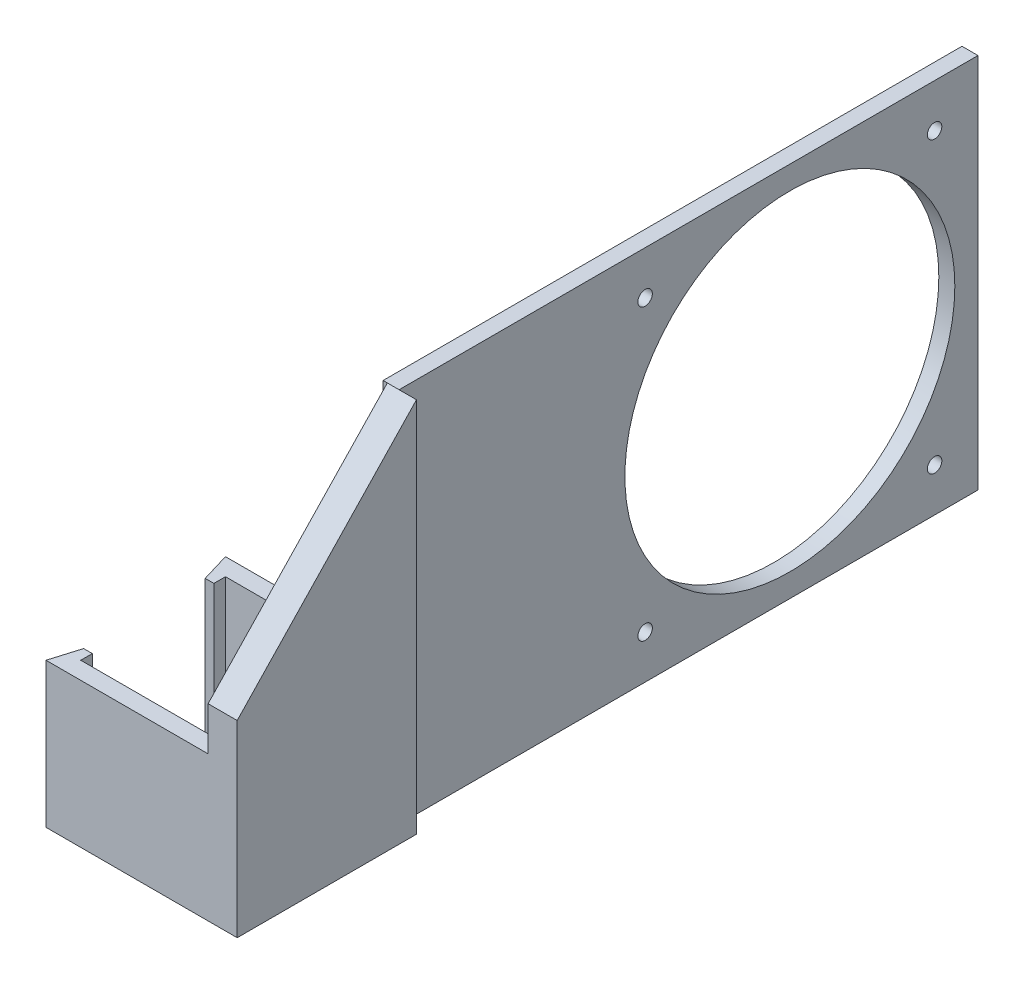
ISO-10303-21;
HEADER;
FILE_DESCRIPTION(('STEP AP214'),'2;1');
FILE_NAME('part.step','',(''),(''),'','','');
FILE_SCHEMA(('AUTOMOTIVE_DESIGN { 1 0 10303 214 1 1 1 1 }'));
ENDSEC;
DATA;
#1=APPLICATION_CONTEXT('core data for automotive mechanical design processes');
#2=APPLICATION_PROTOCOL_DEFINITION('international standard','automotive_design',2000,#1);
#3=PRODUCT_CONTEXT('',#1,'mechanical');
#4=PRODUCT('Part','Part','',(#3));
#5=PRODUCT_RELATED_PRODUCT_CATEGORY('part','',(#4));
#6=PRODUCT_DEFINITION_FORMATION('','',#4);
#7=PRODUCT_DEFINITION_CONTEXT('part definition',#1,'design');
#8=PRODUCT_DEFINITION('design','',#6,#7);
#9=PRODUCT_DEFINITION_SHAPE('','',#8);
#10=(LENGTH_UNIT() NAMED_UNIT(*) SI_UNIT(.MILLI.,.METRE.));
#11=(NAMED_UNIT(*) PLANE_ANGLE_UNIT() SI_UNIT($,.RADIAN.));
#12=(NAMED_UNIT(*) SI_UNIT($,.STERADIAN.) SOLID_ANGLE_UNIT());
#13=UNCERTAINTY_MEASURE_WITH_UNIT(LENGTH_MEASURE(1.E-05),#10,'distance_accuracy_value','');
#14=(GEOMETRIC_REPRESENTATION_CONTEXT(3) GLOBAL_UNCERTAINTY_ASSIGNED_CONTEXT((#13)) GLOBAL_UNIT_ASSIGNED_CONTEXT((#10,
#11,#12)) REPRESENTATION_CONTEXT('',''));
#15=CARTESIAN_POINT('',(0.,0.,0.));
#16=DIRECTION('',(0.,0.,1.));
#17=DIRECTION('',(1.,0.,0.));
#18=AXIS2_PLACEMENT_3D('',#15,#16,#17);
#19=CARTESIAN_POINT('',(0.,25.,0.));
#20=DIRECTION('',(0.,1.,0.));
#21=DIRECTION('',(0.,0.,1.));
#22=AXIS2_PLACEMENT_3D('',#19,#20,#21);
#23=PLANE('',#22);
#24=DIRECTION('',(1.,0.,0.));
#25=VECTOR('',#24,1.);
#26=CARTESIAN_POINT('',(-66.8257575757576,25.,-3.96973979401218));
#27=LINE('',#26,#25);
#28=CARTESIAN_POINT('',(-66.8257575757576,25.,-3.96973979401218));
#29=VERTEX_POINT('',#28);
#30=CARTESIAN_POINT('',(-38.8257575757576,25.,-3.96973979401218));
#31=VERTEX_POINT('',#30);
#32=EDGE_CURVE('E260',#29,#31,#27,.T.);
#33=ORIENTED_EDGE('',*,*,#32,.T.);
#34=DIRECTION('',(0.,0.,1.));
#35=VECTOR('',#34,1.);
#36=CARTESIAN_POINT('',(-38.8257575757576,25.,-34.9382664031757));
#37=LINE('',#36,#35);
#38=CARTESIAN_POINT('',(-38.8257575757576,25.,-6.96973979401218));
#39=VERTEX_POINT('',#38);
#40=EDGE_CURVE('E390',#39,#31,#37,.T.);
#41=ORIENTED_EDGE('',*,*,#40,.F.);
#42=DIRECTION('',(-1.,0.,0.));
#43=VECTOR('',#42,1.);
#44=CARTESIAN_POINT('',(-38.8257575757576,25.,-6.96973979401218));
#45=LINE('',#44,#43);
#46=CARTESIAN_POINT('',(-63.8257575757576,25.,-6.96973979401218));
#47=VERTEX_POINT('',#46);
#48=EDGE_CURVE('E253',#39,#47,#45,.T.);
#49=ORIENTED_EDGE('',*,*,#48,.T.);
#50=DIRECTION('',(0.,0.,-1.));
#51=VECTOR('',#50,1.);
#52=CARTESIAN_POINT('',(-63.8257575757576,25.,-6.96973979401218));
#53=LINE('',#52,#51);
#54=CARTESIAN_POINT('',(-63.8257575757576,25.,-8.96973979401218));
#55=VERTEX_POINT('',#54);
#56=EDGE_CURVE('E255',#47,#55,#53,.T.);
#57=ORIENTED_EDGE('',*,*,#56,.T.);
#58=DIRECTION('',(-1.,0.,0.));
#59=VECTOR('',#58,1.);
#60=CARTESIAN_POINT('',(-63.8257575757576,25.,-8.96973979401218));
#61=LINE('',#60,#59);
#62=CARTESIAN_POINT('',(-65.3257575757576,25.,-8.96973979401218));
#63=VERTEX_POINT('',#62);
#64=EDGE_CURVE('E257',#55,#63,#61,.T.);
#65=ORIENTED_EDGE('',*,*,#64,.T.);
#66=DIRECTION('',(-0.287347885566346,0.,0.957826285221151));
#67=VECTOR('',#66,1.);
#68=CARTESIAN_POINT('',(-66.8257575757576,25.,-3.96973979401218));
#69=LINE('',#68,#67);
#70=EDGE_CURVE('E227',#63,#29,#69,.T.);
#71=ORIENTED_EDGE('',*,*,#70,.T.);
#72=EDGE_LOOP('',(#33,#41,#49,#57,#65,#71));
#73=FACE_BOUND('',#72,.T.);
#74=ADVANCED_FACE('F37',(#73),#23,.T.);
#75=DIRECTION('',(1.,0.,0.));
#76=VECTOR('',#75,1.);
#77=CARTESIAN_POINT('',(-63.8257575757576,25.,-31.9697397940122));
#78=LINE('',#77,#76);
#79=CARTESIAN_POINT('',(-63.8257575757576,25.,-31.9697397940122));
#80=VERTEX_POINT('',#79);
#81=CARTESIAN_POINT('',(-38.8257575757576,25.,-31.9697397940122));
#82=VERTEX_POINT('',#81);
#83=EDGE_CURVE('E250',#80,#82,#78,.T.);
#84=ORIENTED_EDGE('',*,*,#83,.T.);
#85=CARTESIAN_POINT('',(-38.8257575757576,25.,-34.9382664031757));
#86=VERTEX_POINT('',#85);
#87=EDGE_CURVE('E367',#86,#82,#37,.T.);
#88=ORIENTED_EDGE('',*,*,#87,.F.);
#89=DIRECTION('',(1.,0.,0.));
#90=VECTOR('',#89,1.);
#91=CARTESIAN_POINT('',(0.,25.,-34.9382664031757));
#92=LINE('',#91,#90);
#93=CARTESIAN_POINT('',(-39.5643312219053,25.,-34.9382664031757));
#94=VERTEX_POINT('',#93);
#95=EDGE_CURVE('E429',#94,#86,#92,.T.);
#96=ORIENTED_EDGE('',*,*,#95,.F.);
#97=DIRECTION('',(0.,0.,-1.));
#98=VECTOR('',#97,1.);
#99=CARTESIAN_POINT('',(-39.5643312219053,25.,0.));
#100=LINE('',#99,#98);
#101=CARTESIAN_POINT('',(-39.5643312219053,25.,-44.9697397940123));
#102=VERTEX_POINT('',#101);
#103=EDGE_CURVE('E338',#94,#102,#100,.T.);
#104=ORIENTED_EDGE('',*,*,#103,.T.);
#105=DIRECTION('',(0.707106781186544,0.,-0.707106781186551));
#106=VECTOR('',#105,1.);
#107=CARTESIAN_POINT('',(-39.5643312219053,25.,-44.9697397940123));
#108=LINE('',#107,#106);
#109=CARTESIAN_POINT('',(-49.5643312219053,25.,-34.9697397940122));
#110=VERTEX_POINT('',#109);
#111=EDGE_CURVE('E46',#102,#110,#108,.F.);
#112=ORIENTED_EDGE('',*,*,#111,.T.);
#113=DIRECTION('',(-1.,0.,0.));
#114=VECTOR('',#113,1.);
#115=CARTESIAN_POINT('',(-36.5790075050805,25.,-34.9697397940122));
#116=LINE('',#115,#114);
#117=CARTESIAN_POINT('',(-66.8257575757576,25.,-34.9697397940122));
#118=VERTEX_POINT('',#117);
#119=EDGE_CURVE('E246',#110,#118,#116,.T.);
#120=ORIENTED_EDGE('',*,*,#119,.T.);
#121=DIRECTION('',(0.287347885566346,0.,0.957826285221151));
#122=VECTOR('',#121,1.);
#123=CARTESIAN_POINT('',(-66.8257575757576,25.,-34.9697397940122));
#124=LINE('',#123,#122);
#125=CARTESIAN_POINT('',(-65.3257575757576,25.,-29.9697397940122));
#126=VERTEX_POINT('',#125);
#127=EDGE_CURVE('E236',#118,#126,#124,.T.);
#128=ORIENTED_EDGE('',*,*,#127,.T.);
#129=DIRECTION('',(1.,0.,0.));
#130=VECTOR('',#129,1.);
#131=CARTESIAN_POINT('',(-66.8257575757576,25.,-29.9697397940122));
#132=LINE('',#131,#130);
#133=CARTESIAN_POINT('',(-63.8257575757576,25.,-29.9697397940122));
#134=VERTEX_POINT('',#133);
#135=EDGE_CURVE('E245',#126,#134,#132,.T.);
#136=ORIENTED_EDGE('',*,*,#135,.T.);
#137=DIRECTION('',(0.,0.,-1.));
#138=VECTOR('',#137,1.);
#139=CARTESIAN_POINT('',(-63.8257575757576,25.,-29.9697397940122));
#140=LINE('',#139,#138);
#141=EDGE_CURVE('E248',#134,#80,#140,.T.);
#142=ORIENTED_EDGE('',*,*,#141,.T.);
#143=EDGE_LOOP('',(#84,#88,#96,#104,#112,#120,#128,#136,#142));
#144=FACE_BOUND('',#143,.T.);
#145=ADVANCED_FACE('F355',(#144),#23,.T.);
#146=DIRECTION('',(0.,0.,1.));
#147=VECTOR('',#146,1.);
#148=CARTESIAN_POINT('',(-36.7989439252784,25.,0.));
#149=LINE('',#148,#147);
#150=CARTESIAN_POINT('',(-36.7989439252784,25.,-34.9697397940122));
#151=VERTEX_POINT('',#150);
#152=CARTESIAN_POINT('',(-36.7989439252784,25.,-34.9382664031757));
#153=VERTEX_POINT('',#152);
#154=EDGE_CURVE('E432',#151,#153,#149,.T.);
#155=ORIENTED_EDGE('',*,*,#154,.T.);
#156=DIRECTION('',(-1.,0.,0.));
#157=VECTOR('',#156,1.);
#158=CARTESIAN_POINT('',(-33.7989439252784,25.,-34.9382664031757));
#159=LINE('',#158,#157);
#160=CARTESIAN_POINT('',(-36.5643312219053,25.,-34.9382664031757));
#161=VERTEX_POINT('',#160);
#162=EDGE_CURVE('E392',#161,#153,#159,.T.);
#163=ORIENTED_EDGE('',*,*,#162,.F.);
#164=DIRECTION('',(-0.422618261740694,0.,-0.906307787036653));
#165=VECTOR('',#164,1.);
#166=CARTESIAN_POINT('',(-22.1234701022757,25.,-3.96973979401218));
#167=LINE('',#166,#165);
#168=CARTESIAN_POINT('',(-36.5790075050805,25.,-34.9697397940122));
#169=VERTEX_POINT('',#168);
#170=EDGE_CURVE('E263',#161,#169,#167,.T.);
#171=ORIENTED_EDGE('',*,*,#170,.T.);
#172=EDGE_CURVE('E242',#169,#151,#116,.T.);
#173=ORIENTED_EDGE('',*,*,#172,.T.);
#174=EDGE_LOOP('',(#155,#163,#171,#173));
#175=FACE_BOUND('',#174,.T.);
#176=ADVANCED_FACE('F474',(#175),#23,.T.);
#177=CARTESIAN_POINT('',(0.,0.,-34.9382664031757));
#178=DIRECTION('',(0.,0.,1.));
#179=DIRECTION('',(1.,0.,0.));
#180=AXIS2_PLACEMENT_3D('',#177,#178,#179);
#181=PLANE('',#180);
#182=ORIENTED_EDGE('',*,*,#95,.T.);
#183=DIRECTION('',(0.,-1.,0.));
#184=VECTOR('',#183,1.);
#185=CARTESIAN_POINT('',(-38.8257575757576,96.3738505099248,-34.9382664031757));
#186=LINE('',#185,#184);
#187=CARTESIAN_POINT('',(-38.8257575757576,65.,-34.9382664031757));
#188=VERTEX_POINT('',#187);
#189=EDGE_CURVE('E399',#188,#86,#186,.T.);
#190=ORIENTED_EDGE('',*,*,#189,.F.);
#191=DIRECTION('',(1.,0.,0.));
#192=VECTOR('',#191,1.);
#193=CARTESIAN_POINT('',(-36.7989439252784,65.,-34.9382664031757));
#194=LINE('',#193,#192);
#195=CARTESIAN_POINT('',(-39.5643312219053,65.,-34.9382664031757));
#196=VERTEX_POINT('',#195);
#197=EDGE_CURVE('E406',#196,#188,#194,.T.);
#198=ORIENTED_EDGE('',*,*,#197,.F.);
#199=DIRECTION('',(0.,1.,0.));
#200=VECTOR('',#199,1.);
#201=CARTESIAN_POINT('',(-39.5643312219053,0.,-34.9382664031757));
#202=LINE('',#201,#200);
#203=EDGE_CURVE('E416',#94,#196,#202,.T.);
#204=ORIENTED_EDGE('',*,*,#203,.F.);
#205=EDGE_LOOP('',(#182,#190,#198,#204));
#206=FACE_BOUND('',#205,.T.);
#207=ADVANCED_FACE('F491',(#206),#181,.T.);
#208=CARTESIAN_POINT('',(-36.5790075050805,25.,-34.9697397940122));
#209=DIRECTION('',(0.,0.,1.));
#210=DIRECTION('',(1.,0.,0.));
#211=AXIS2_PLACEMENT_3D('',#208,#209,#210);
#212=PLANE('',#211);
#213=DIRECTION('',(0.,-1.,0.));
#214=VECTOR('',#213,1.);
#215=CARTESIAN_POINT('',(-36.7989439252784,25.,-34.9697397940122));
#216=LINE('',#215,#214);
#217=CARTESIAN_POINT('',(-36.7989439252784,0.,-34.9697397940122));
#218=VERTEX_POINT('',#217);
#219=EDGE_CURVE('E435',#151,#218,#216,.T.);
#220=ORIENTED_EDGE('',*,*,#219,.F.);
#221=ORIENTED_EDGE('',*,*,#172,.F.);
#222=DIRECTION('',(0.,-1.,0.));
#223=VECTOR('',#222,1.);
#224=CARTESIAN_POINT('',(-36.5790075050805,25.,-34.9697397940122));
#225=LINE('',#224,#223);
#226=CARTESIAN_POINT('',(-36.5790075050805,0.,-34.9697397940122));
#227=VERTEX_POINT('',#226);
#228=EDGE_CURVE('E265',#169,#227,#225,.T.);
#229=ORIENTED_EDGE('',*,*,#228,.T.);
#230=DIRECTION('',(-1.,0.,0.));
#231=VECTOR('',#230,1.);
#232=CARTESIAN_POINT('',(-36.5790075050805,0.,-34.9697397940122));
#233=LINE('',#232,#231);
#234=EDGE_CURVE('E266',#227,#218,#233,.T.);
#235=ORIENTED_EDGE('',*,*,#234,.T.);
#236=EDGE_LOOP('',(#220,#221,#229,#235));
#237=FACE_BOUND('',#236,.T.);
#238=ADVANCED_FACE('F479',(#237),#212,.F.);
#239=ORIENTED_EDGE('',*,*,#119,.F.);
#240=DIRECTION('',(0.,-1.,0.));
#241=VECTOR('',#240,1.);
#242=CARTESIAN_POINT('',(-49.5643312219053,0.,-34.9697397940122));
#243=LINE('',#242,#241);
#244=CARTESIAN_POINT('',(-49.5643312219053,0.,-34.9697397940122));
#245=VERTEX_POINT('',#244);
#246=EDGE_CURVE('E59',#110,#245,#243,.T.);
#247=ORIENTED_EDGE('',*,*,#246,.T.);
#248=CARTESIAN_POINT('',(-66.8257575757576,0.,-34.9697397940122));
#249=VERTEX_POINT('',#248);
#250=EDGE_CURVE('E235',#245,#249,#233,.T.);
#251=ORIENTED_EDGE('',*,*,#250,.T.);
#252=DIRECTION('',(0.,-1.,0.));
#253=VECTOR('',#252,1.);
#254=CARTESIAN_POINT('',(-66.8257575757576,25.,-34.9697397940122));
#255=LINE('',#254,#253);
#256=EDGE_CURVE('E308',#118,#249,#255,.T.);
#257=ORIENTED_EDGE('',*,*,#256,.F.);
#258=EDGE_LOOP('',(#239,#247,#251,#257));
#259=FACE_BOUND('',#258,.T.);
#260=ADVANCED_FACE('F350',(#259),#212,.F.);
#261=CARTESIAN_POINT('',(-66.8257575757576,25.,-29.9697397940122));
#262=DIRECTION('',(0.,0.,-1.));
#263=DIRECTION('',(-1.,0.,0.));
#264=AXIS2_PLACEMENT_3D('',#261,#262,#263);
#265=PLANE('',#264);
#266=ORIENTED_EDGE('',*,*,#135,.F.);
#267=DIRECTION('',(0.,-1.,0.));
#268=VECTOR('',#267,1.);
#269=CARTESIAN_POINT('',(-65.3257575757576,25.,-29.9697397940122));
#270=LINE('',#269,#268);
#271=CARTESIAN_POINT('',(-65.3257575757576,0.,-29.9697397940122));
#272=VERTEX_POINT('',#271);
#273=EDGE_CURVE('E233',#126,#272,#270,.T.);
#274=ORIENTED_EDGE('',*,*,#273,.T.);
#275=DIRECTION('',(1.,0.,0.));
#276=VECTOR('',#275,1.);
#277=CARTESIAN_POINT('',(-66.8257575757576,0.,-29.9697397940122));
#278=LINE('',#277,#276);
#279=CARTESIAN_POINT('',(-63.8257575757576,0.,-29.9697397940122));
#280=VERTEX_POINT('',#279);
#281=EDGE_CURVE('E268',#272,#280,#278,.T.);
#282=ORIENTED_EDGE('',*,*,#281,.T.);
#283=DIRECTION('',(0.,-1.,0.));
#284=VECTOR('',#283,1.);
#285=CARTESIAN_POINT('',(-63.8257575757576,25.,-29.9697397940122));
#286=LINE('',#285,#284);
#287=EDGE_CURVE('E305',#134,#280,#286,.T.);
#288=ORIENTED_EDGE('',*,*,#287,.F.);
#289=EDGE_LOOP('',(#266,#274,#282,#288));
#290=FACE_BOUND('',#289,.T.);
#291=ADVANCED_FACE('F358',(#290),#265,.F.);
#292=CARTESIAN_POINT('',(-63.8257575757576,25.,-29.9697397940122));
#293=DIRECTION('',(-1.,0.,0.));
#294=DIRECTION('',(0.,0.,1.));
#295=AXIS2_PLACEMENT_3D('',#292,#293,#294);
#296=PLANE('',#295);
#297=DIRECTION('',(0.,0.,-1.));
#298=VECTOR('',#297,1.);
#299=CARTESIAN_POINT('',(-63.8257575757576,0.,-29.9697397940122));
#300=LINE('',#299,#298);
#301=CARTESIAN_POINT('',(-63.8257575757576,0.,-31.9697397940122));
#302=VERTEX_POINT('',#301);
#303=EDGE_CURVE('E270',#280,#302,#300,.T.);
#304=ORIENTED_EDGE('',*,*,#303,.T.);
#305=DIRECTION('',(0.,-1.,0.));
#306=VECTOR('',#305,1.);
#307=CARTESIAN_POINT('',(-63.8257575757576,25.,-31.9697397940122));
#308=LINE('',#307,#306);
#309=EDGE_CURVE('E302',#80,#302,#308,.T.);
#310=ORIENTED_EDGE('',*,*,#309,.F.);
#311=ORIENTED_EDGE('',*,*,#141,.F.);
#312=ORIENTED_EDGE('',*,*,#287,.T.);
#313=EDGE_LOOP('',(#304,#310,#311,#312));
#314=FACE_BOUND('',#313,.T.);
#315=ADVANCED_FACE('F363',(#314),#296,.F.);
#316=CARTESIAN_POINT('',(-63.8257575757576,25.,-31.9697397940122));
#317=DIRECTION('',(0.,0.,-1.));
#318=DIRECTION('',(-1.,0.,0.));
#319=AXIS2_PLACEMENT_3D('',#316,#317,#318);
#320=PLANE('',#319);
#321=DIRECTION('',(1.,0.,0.));
#322=VECTOR('',#321,1.);
#323=CARTESIAN_POINT('',(-63.8257575757576,0.,-31.9697397940122));
#324=LINE('',#323,#322);
#325=CARTESIAN_POINT('',(-38.8257575757576,0.,-31.9697397940122));
#326=VERTEX_POINT('',#325);
#327=EDGE_CURVE('E272',#302,#326,#324,.T.);
#328=ORIENTED_EDGE('',*,*,#327,.T.);
#329=DIRECTION('',(0.,-1.,0.));
#330=VECTOR('',#329,1.);
#331=CARTESIAN_POINT('',(-38.8257575757576,25.,-31.9697397940122));
#332=LINE('',#331,#330);
#333=EDGE_CURVE('E299',#82,#326,#332,.T.);
#334=ORIENTED_EDGE('',*,*,#333,.F.);
#335=ORIENTED_EDGE('',*,*,#83,.F.);
#336=ORIENTED_EDGE('',*,*,#309,.T.);
#337=EDGE_LOOP('',(#328,#334,#335,#336));
#338=FACE_BOUND('',#337,.T.);
#339=ADVANCED_FACE('F370',(#338),#320,.F.);
#340=CARTESIAN_POINT('',(-38.8257575757576,25.,-31.9697397940122));
#341=DIRECTION('',(1.,0.,0.));
#342=DIRECTION('',(0.,0.,-1.));
#343=AXIS2_PLACEMENT_3D('',#340,#341,#342);
#344=PLANE('',#343);
#345=DIRECTION('',(0.,-1.,0.));
#346=VECTOR('',#345,1.);
#347=CARTESIAN_POINT('',(-38.8257575757576,96.3738505099248,-3.96973979401218));
#348=LINE('',#347,#346);
#349=CARTESIAN_POINT('',(-38.8257575757576,32.5,-3.96973979401218));
#350=VERTEX_POINT('',#349);
#351=EDGE_CURVE('E394',#350,#31,#348,.T.);
#352=ORIENTED_EDGE('',*,*,#351,.F.);
#353=DIRECTION('',(0.,0.72395829288421,-0.689843743295669));
#354=VECTOR('',#353,1.);
#355=CARTESIAN_POINT('',(-38.8257575757576,42.5528396913205,-13.5488669779603));
#356=LINE('',#355,#354);
#357=EDGE_CURVE('E196',#350,#188,#356,.T.);
#358=ORIENTED_EDGE('',*,*,#357,.T.);
#359=ORIENTED_EDGE('',*,*,#189,.T.);
#360=ORIENTED_EDGE('',*,*,#87,.T.);
#361=ORIENTED_EDGE('',*,*,#333,.T.);
#362=DIRECTION('',(0.,0.,1.));
#363=VECTOR('',#362,1.);
#364=CARTESIAN_POINT('',(-38.8257575757576,0.,-31.9697397940122));
#365=LINE('',#364,#363);
#366=CARTESIAN_POINT('',(-38.8257575757576,0.,-6.96973979401218));
#367=VERTEX_POINT('',#366);
#368=EDGE_CURVE('E274',#326,#367,#365,.T.);
#369=ORIENTED_EDGE('',*,*,#368,.T.);
#370=DIRECTION('',(0.,-1.,0.));
#371=VECTOR('',#370,1.);
#372=CARTESIAN_POINT('',(-38.8257575757576,25.,-6.96973979401218));
#373=LINE('',#372,#371);
#374=EDGE_CURVE('E296',#39,#367,#373,.T.);
#375=ORIENTED_EDGE('',*,*,#374,.F.);
#376=ORIENTED_EDGE('',*,*,#40,.T.);
#377=EDGE_LOOP('',(#352,#358,#359,#360,#361,#369,#375,#376));
#378=FACE_BOUND('',#377,.T.);
#379=ADVANCED_FACE('F374',(#378),#344,.F.);
#380=CARTESIAN_POINT('',(-38.8257575757576,25.,-6.96973979401218));
#381=DIRECTION('',(0.,0.,1.));
#382=DIRECTION('',(1.,0.,0.));
#383=AXIS2_PLACEMENT_3D('',#380,#381,#382);
#384=PLANE('',#383);
#385=DIRECTION('',(-1.,0.,0.));
#386=VECTOR('',#385,1.);
#387=CARTESIAN_POINT('',(-38.8257575757576,0.,-6.96973979401218));
#388=LINE('',#387,#386);
#389=CARTESIAN_POINT('',(-63.8257575757576,0.,-6.96973979401218));
#390=VERTEX_POINT('',#389);
#391=EDGE_CURVE('E276',#367,#390,#388,.T.);
#392=ORIENTED_EDGE('',*,*,#391,.T.);
#393=DIRECTION('',(0.,-1.,0.));
#394=VECTOR('',#393,1.);
#395=CARTESIAN_POINT('',(-63.8257575757576,25.,-6.96973979401218));
#396=LINE('',#395,#394);
#397=EDGE_CURVE('E293',#47,#390,#396,.T.);
#398=ORIENTED_EDGE('',*,*,#397,.F.);
#399=ORIENTED_EDGE('',*,*,#48,.F.);
#400=ORIENTED_EDGE('',*,*,#374,.T.);
#401=EDGE_LOOP('',(#392,#398,#399,#400));
#402=FACE_BOUND('',#401,.T.);
#403=ADVANCED_FACE('F381',(#402),#384,.F.);
#404=CARTESIAN_POINT('',(-63.8257575757576,25.,-6.96973979401218));
#405=DIRECTION('',(-1.,0.,0.));
#406=DIRECTION('',(0.,0.,1.));
#407=AXIS2_PLACEMENT_3D('',#404,#405,#406);
#408=PLANE('',#407);
#409=DIRECTION('',(0.,0.,-1.));
#410=VECTOR('',#409,1.);
#411=CARTESIAN_POINT('',(-63.8257575757576,0.,-6.96973979401218));
#412=LINE('',#411,#410);
#413=CARTESIAN_POINT('',(-63.8257575757576,0.,-8.96973979401218));
#414=VERTEX_POINT('',#413);
#415=EDGE_CURVE('E278',#390,#414,#412,.T.);
#416=ORIENTED_EDGE('',*,*,#415,.T.);
#417=DIRECTION('',(0.,-1.,0.));
#418=VECTOR('',#417,1.);
#419=CARTESIAN_POINT('',(-63.8257575757576,25.,-8.96973979401218));
#420=LINE('',#419,#418);
#421=EDGE_CURVE('E290',#55,#414,#420,.T.);
#422=ORIENTED_EDGE('',*,*,#421,.F.);
#423=ORIENTED_EDGE('',*,*,#56,.F.);
#424=ORIENTED_EDGE('',*,*,#397,.T.);
#425=EDGE_LOOP('',(#416,#422,#423,#424));
#426=FACE_BOUND('',#425,.T.);
#427=ADVANCED_FACE('F385',(#426),#408,.F.);
#428=CARTESIAN_POINT('',(-63.8257575757576,25.,-8.96973979401218));
#429=DIRECTION('',(0.,0.,1.));
#430=DIRECTION('',(1.,0.,0.));
#431=AXIS2_PLACEMENT_3D('',#428,#429,#430);
#432=PLANE('',#431);
#433=DIRECTION('',(-1.,0.,0.));
#434=VECTOR('',#433,1.);
#435=CARTESIAN_POINT('',(-63.8257575757576,0.,-8.96973979401218));
#436=LINE('',#435,#434);
#437=CARTESIAN_POINT('',(-65.3257575757576,0.,-8.96973979401218));
#438=VERTEX_POINT('',#437);
#439=EDGE_CURVE('E280',#414,#438,#436,.T.);
#440=ORIENTED_EDGE('',*,*,#439,.T.);
#441=DIRECTION('',(0.,-1.,0.));
#442=VECTOR('',#441,1.);
#443=CARTESIAN_POINT('',(-65.3257575757576,25.,-8.96973979401218));
#444=LINE('',#443,#442);
#445=EDGE_CURVE('E230',#63,#438,#444,.T.);
#446=ORIENTED_EDGE('',*,*,#445,.F.);
#447=ORIENTED_EDGE('',*,*,#64,.F.);
#448=ORIENTED_EDGE('',*,*,#421,.T.);
#449=EDGE_LOOP('',(#440,#446,#447,#448));
#450=FACE_BOUND('',#449,.T.);
#451=ADVANCED_FACE('F516',(#450),#432,.F.);
#452=CARTESIAN_POINT('',(-66.8257575757576,25.,-3.96973979401218));
#453=DIRECTION('',(0.,0.,-1.));
#454=DIRECTION('',(-1.,0.,0.));
#455=AXIS2_PLACEMENT_3D('',#452,#453,#454);
#456=PLANE('',#455);
#457=DIRECTION('',(0.,-1.,0.));
#458=VECTOR('',#457,1.);
#459=CARTESIAN_POINT('',(-33.7989439252784,56.3695655108971,-3.96973979401218));
#460=LINE('',#459,#458);
#461=CARTESIAN_POINT('',(-33.7989439252784,32.5,-3.96973979401218));
#462=VERTEX_POINT('',#461);
#463=CARTESIAN_POINT('',(-33.7989439252784,0.,-3.96973979401218));
#464=VERTEX_POINT('',#463);
#465=EDGE_CURVE('E204',#462,#464,#460,.T.);
#466=ORIENTED_EDGE('',*,*,#465,.F.);
#467=DIRECTION('',(1.,0.,0.));
#468=VECTOR('',#467,1.);
#469=CARTESIAN_POINT('',(-133.798943925278,32.5,-3.96973979401218));
#470=LINE('',#469,#468);
#471=EDGE_CURVE('E190',#350,#462,#470,.T.);
#472=ORIENTED_EDGE('',*,*,#471,.F.);
#473=ORIENTED_EDGE('',*,*,#351,.T.);
#474=ORIENTED_EDGE('',*,*,#32,.F.);
#475=DIRECTION('',(0.,-1.,0.));
#476=VECTOR('',#475,1.);
#477=CARTESIAN_POINT('',(-66.8257575757576,25.,-3.96973979401218));
#478=LINE('',#477,#476);
#479=CARTESIAN_POINT('',(-66.8257575757576,0.,-3.96973979401218));
#480=VERTEX_POINT('',#479);
#481=EDGE_CURVE('E288',#29,#480,#478,.T.);
#482=ORIENTED_EDGE('',*,*,#481,.T.);
#483=DIRECTION('',(1.,0.,0.));
#484=VECTOR('',#483,1.);
#485=CARTESIAN_POINT('',(-66.8257575757576,0.,-3.96973979401218));
#486=LINE('',#485,#484);
#487=EDGE_CURVE('E214',#480,#464,#486,.T.);
#488=ORIENTED_EDGE('',*,*,#487,.T.);
#489=EDGE_LOOP('',(#466,#472,#473,#474,#482,#488));
#490=FACE_BOUND('',#489,.T.);
#491=ADVANCED_FACE('F211',(#490),#456,.F.);
#492=CARTESIAN_POINT('',(-22.1234701022757,25.,-3.96973979401218));
#493=DIRECTION('',(-0.906307787036653,0.,0.422618261740694));
#494=DIRECTION('',(0.422618261740694,0.,0.906307787036653));
#495=AXIS2_PLACEMENT_3D('',#492,#493,#494);
#496=PLANE('',#495);
#497=ORIENTED_EDGE('',*,*,#170,.F.);
#498=DIRECTION('',(0.,-1.,0.));
#499=VECTOR('',#498,1.);
#500=CARTESIAN_POINT('',(-36.5643312219053,25.,-34.9382664031757));
#501=LINE('',#500,#499);
#502=CARTESIAN_POINT('',(-36.5643312219053,0.,-34.9382664031757));
#503=VERTEX_POINT('',#502);
#504=EDGE_CURVE('E216',#161,#503,#501,.T.);
#505=ORIENTED_EDGE('',*,*,#504,.T.);
#506=DIRECTION('',(-0.422618261740694,0.,-0.906307787036653));
#507=VECTOR('',#506,1.);
#508=CARTESIAN_POINT('',(-22.1234701022757,0.,-3.96973979401218));
#509=LINE('',#508,#507);
#510=EDGE_CURVE('E284',#503,#227,#509,.T.);
#511=ORIENTED_EDGE('',*,*,#510,.T.);
#512=ORIENTED_EDGE('',*,*,#228,.F.);
#513=EDGE_LOOP('',(#497,#505,#511,#512));
#514=FACE_BOUND('',#513,.T.);
#515=ADVANCED_FACE('F510',(#514),#496,.F.);
#516=CARTESIAN_POINT('',(0.,0.,0.));
#517=DIRECTION('',(0.,1.,0.));
#518=DIRECTION('',(0.,0.,1.));
#519=AXIS2_PLACEMENT_3D('',#516,#517,#518);
#520=PLANE('',#519);
#521=ORIENTED_EDGE('',*,*,#250,.F.);
#522=DIRECTION('',(-0.707106781186544,0.,0.707106781186551));
#523=VECTOR('',#522,1.);
#524=CARTESIAN_POINT('',(-42.267035507959,0.,-42.2670355079585));
#525=LINE('',#524,#523);
#526=CARTESIAN_POINT('',(-39.5643312219053,0.,-44.9697397940123));
#527=VERTEX_POINT('',#526);
#528=EDGE_CURVE('E11',#245,#527,#525,.F.);
#529=ORIENTED_EDGE('',*,*,#528,.T.);
#530=DIRECTION('',(0.,0.,1.));
#531=VECTOR('',#530,1.);
#532=CARTESIAN_POINT('',(-39.5643312219053,0.,-134.938266403176));
#533=LINE('',#532,#531);
#534=CARTESIAN_POINT('',(-39.5643312219053,0.,-134.938266403176));
#535=VERTEX_POINT('',#534);
#536=EDGE_CURVE('E342',#535,#527,#533,.T.);
#537=ORIENTED_EDGE('',*,*,#536,.F.);
#538=DIRECTION('',(-1.,0.,0.));
#539=VECTOR('',#538,1.);
#540=CARTESIAN_POINT('',(-36.7989439252784,0.,-134.938266403176));
#541=LINE('',#540,#539);
#542=CARTESIAN_POINT('',(-36.7989439252784,0.,-134.938266403176));
#543=VERTEX_POINT('',#542);
#544=EDGE_CURVE('E405',#543,#535,#541,.T.);
#545=ORIENTED_EDGE('',*,*,#544,.F.);
#546=DIRECTION('',(0.,0.,1.));
#547=VECTOR('',#546,1.);
#548=CARTESIAN_POINT('',(-36.7989439252784,0.,-134.938266403176));
#549=LINE('',#548,#547);
#550=EDGE_CURVE('E426',#543,#218,#549,.T.);
#551=ORIENTED_EDGE('',*,*,#550,.T.);
#552=ORIENTED_EDGE('',*,*,#234,.F.);
#553=ORIENTED_EDGE('',*,*,#510,.F.);
#554=DIRECTION('',(1.,0.,0.));
#555=VECTOR('',#554,1.);
#556=CARTESIAN_POINT('',(-38.7989439252784,0.,-34.9382664031757));
#557=LINE('',#556,#555);
#558=CARTESIAN_POINT('',(-33.7989439252784,0.,-34.9382664031757));
#559=VERTEX_POINT('',#558);
#560=EDGE_CURVE('E224',#503,#559,#557,.T.);
#561=ORIENTED_EDGE('',*,*,#560,.T.);
#562=DIRECTION('',(0.,0.,1.));
#563=VECTOR('',#562,1.);
#564=CARTESIAN_POINT('',(-33.7989439252784,0.,-3.96973979401218));
#565=LINE('',#564,#563);
#566=EDGE_CURVE('E221',#559,#464,#565,.T.);
#567=ORIENTED_EDGE('',*,*,#566,.T.);
#568=ORIENTED_EDGE('',*,*,#487,.F.);
#569=DIRECTION('',(-0.287347885566346,0.,0.957826285221151));
#570=VECTOR('',#569,1.);
#571=CARTESIAN_POINT('',(-66.8257575757576,0.,-3.96973979401218));
#572=LINE('',#571,#570);
#573=EDGE_CURVE('E231',#438,#480,#572,.T.);
#574=ORIENTED_EDGE('',*,*,#573,.F.);
#575=ORIENTED_EDGE('',*,*,#439,.F.);
#576=ORIENTED_EDGE('',*,*,#415,.F.);
#577=ORIENTED_EDGE('',*,*,#391,.F.);
#578=ORIENTED_EDGE('',*,*,#368,.F.);
#579=ORIENTED_EDGE('',*,*,#327,.F.);
#580=ORIENTED_EDGE('',*,*,#303,.F.);
#581=ORIENTED_EDGE('',*,*,#281,.F.);
#582=DIRECTION('',(0.287347885566346,0.,0.957826285221151));
#583=VECTOR('',#582,1.);
#584=CARTESIAN_POINT('',(-66.8257575757576,0.,-34.9697397940122));
#585=LINE('',#584,#583);
#586=EDGE_CURVE('E219',#249,#272,#585,.T.);
#587=ORIENTED_EDGE('',*,*,#586,.F.);
#588=EDGE_LOOP('',(#521,#529,#537,#545,#551,#552,#553,#561,#567,#568,#574,#575,#576,#577,#578,
#579,#580,#581,#587));
#589=FACE_BOUND('',#588,.T.);
#590=ADVANCED_FACE('F346',(#589),#520,.F.);
#591=CARTESIAN_POINT('',(-66.8257575757576,25.,-34.9697397940122));
#592=DIRECTION('',(0.957826285221151,0.,-0.287347885566346));
#593=DIRECTION('',(-0.287347885566346,0.,-0.957826285221151));
#594=AXIS2_PLACEMENT_3D('',#591,#592,#593);
#595=PLANE('',#594);
#596=ORIENTED_EDGE('',*,*,#586,.T.);
#597=ORIENTED_EDGE('',*,*,#273,.F.);
#598=ORIENTED_EDGE('',*,*,#127,.F.);
#599=ORIENTED_EDGE('',*,*,#256,.T.);
#600=EDGE_LOOP('',(#596,#597,#598,#599));
#601=FACE_BOUND('',#600,.T.);
#602=ADVANCED_FACE('F353',(#601),#595,.F.);
#603=CARTESIAN_POINT('',(-66.8257575757576,25.,-3.96973979401218));
#604=DIRECTION('',(0.957826285221151,0.,0.287347885566346));
#605=DIRECTION('',(0.287347885566346,0.,-0.957826285221151));
#606=AXIS2_PLACEMENT_3D('',#603,#604,#605);
#607=PLANE('',#606);
#608=ORIENTED_EDGE('',*,*,#573,.T.);
#609=ORIENTED_EDGE('',*,*,#481,.F.);
#610=ORIENTED_EDGE('',*,*,#70,.F.);
#611=ORIENTED_EDGE('',*,*,#445,.T.);
#612=EDGE_LOOP('',(#608,#609,#610,#611));
#613=FACE_BOUND('',#612,.T.);
#614=ADVANCED_FACE('F549',(#613),#607,.F.);
#615=CARTESIAN_POINT('',(-38.7989439252784,56.3695655108971,-34.9382664031757));
#616=DIRECTION('',(0.,0.,-1.));
#617=DIRECTION('',(-1.,0.,0.));
#618=AXIS2_PLACEMENT_3D('',#615,#616,#617);
#619=PLANE('',#618);
#620=ORIENTED_EDGE('',*,*,#504,.F.);
#621=ORIENTED_EDGE('',*,*,#162,.T.);
#622=DIRECTION('',(0.,-1.,0.));
#623=VECTOR('',#622,1.);
#624=CARTESIAN_POINT('',(-36.7989439252784,0.,-34.9382664031757));
#625=LINE('',#624,#623);
#626=CARTESIAN_POINT('',(-36.7989439252784,65.,-34.9382664031757));
#627=VERTEX_POINT('',#626);
#628=EDGE_CURVE('E413',#627,#153,#625,.T.);
#629=ORIENTED_EDGE('',*,*,#628,.F.);
#630=DIRECTION('',(1.,0.,0.));
#631=VECTOR('',#630,1.);
#632=CARTESIAN_POINT('',(-33.7989439252784,65.,-34.9382664031757));
#633=LINE('',#632,#631);
#634=CARTESIAN_POINT('',(-33.7989439252784,65.,-34.9382664031757));
#635=VERTEX_POINT('',#634);
#636=EDGE_CURVE('E401',#627,#635,#633,.T.);
#637=ORIENTED_EDGE('',*,*,#636,.T.);
#638=DIRECTION('',(0.,-1.,0.));
#639=VECTOR('',#638,1.);
#640=CARTESIAN_POINT('',(-33.7989439252784,56.3695655108971,-34.9382664031757));
#641=LINE('',#640,#639);
#642=EDGE_CURVE('E207',#635,#559,#641,.T.);
#643=ORIENTED_EDGE('',*,*,#642,.T.);
#644=ORIENTED_EDGE('',*,*,#560,.F.);
#645=EDGE_LOOP('',(#620,#621,#629,#637,#643,#644));
#646=FACE_BOUND('',#645,.T.);
#647=ADVANCED_FACE('F441',(#646),#619,.T.);
#648=CARTESIAN_POINT('',(-33.7989439252784,56.3695655108971,-3.96973979401218));
#649=DIRECTION('',(1.,0.,0.));
#650=DIRECTION('',(0.,0.,-1.));
#651=AXIS2_PLACEMENT_3D('',#648,#649,#650);
#652=PLANE('',#651);
#653=DIRECTION('',(0.,0.72395829288421,-0.689843743295669));
#654=VECTOR('',#653,1.);
#655=CARTESIAN_POINT('',(-33.7989439252784,65.,-34.9382664031757));
#656=LINE('',#655,#654);
#657=EDGE_CURVE('E193',#462,#635,#656,.T.);
#658=ORIENTED_EDGE('',*,*,#657,.F.);
#659=ORIENTED_EDGE('',*,*,#465,.T.);
#660=ORIENTED_EDGE('',*,*,#566,.F.);
#661=ORIENTED_EDGE('',*,*,#642,.F.);
#662=EDGE_LOOP('',(#658,#659,#660,#661));
#663=FACE_BOUND('',#662,.T.);
#664=ADVANCED_FACE('F202',(#663),#652,.T.);
#665=CARTESIAN_POINT('',(-36.7989439252784,0.,-134.938266403176));
#666=DIRECTION('',(-1.,0.,0.));
#667=DIRECTION('',(0.,0.,1.));
#668=AXIS2_PLACEMENT_3D('',#665,#666,#667);
#669=PLANE('',#668);
#670=CARTESIAN_POINT('',(-36.7989439252784,7.49999999999999,-77.4382664031757));
#671=DIRECTION('',(1.,0.,0.));
#672=DIRECTION('',(0.,0.,-1.));
#673=AXIS2_PLACEMENT_3D('',#670,#671,#672);
#674=CIRCLE('',#673,1.25);
#675=CARTESIAN_POINT('',(-36.7989439252784,7.49999999999999,-78.6882664031757));
#676=VERTEX_POINT('',#675);
#677=EDGE_CURVE('E450',#676,#676,#674,.T.);
#678=ORIENTED_EDGE('',*,*,#677,.F.);
#679=EDGE_LOOP('',(#678));
#680=FACE_BOUND('',#679,.T.);
#681=CARTESIAN_POINT('',(-36.7989439252784,7.49999999999999,-127.438266403176));
#682=DIRECTION('',(1.,0.,0.));
#683=DIRECTION('',(0.,0.,-1.));
#684=AXIS2_PLACEMENT_3D('',#681,#682,#683);
#685=CIRCLE('',#684,1.25000000000001);
#686=CARTESIAN_POINT('',(-36.7989439252784,7.49999999999999,-128.688266403176));
#687=VERTEX_POINT('',#686);
#688=EDGE_CURVE('E453',#687,#687,#685,.T.);
#689=ORIENTED_EDGE('',*,*,#688,.F.);
#690=EDGE_LOOP('',(#689));
#691=FACE_BOUND('',#690,.T.);
#692=CARTESIAN_POINT('',(-36.7989439252784,57.5,-127.438266403176));
#693=DIRECTION('',(1.,0.,0.));
#694=DIRECTION('',(0.,0.,-1.));
#695=AXIS2_PLACEMENT_3D('',#692,#693,#694);
#696=CIRCLE('',#695,1.25000000000001);
#697=CARTESIAN_POINT('',(-36.7989439252784,57.5,-128.688266403176));
#698=VERTEX_POINT('',#697);
#699=EDGE_CURVE('E449',#698,#698,#696,.T.);
#700=ORIENTED_EDGE('',*,*,#699,.F.);
#701=EDGE_LOOP('',(#700));
#702=FACE_BOUND('',#701,.T.);
#703=CARTESIAN_POINT('',(-36.7989439252784,57.5,-77.4382664031757));
#704=DIRECTION('',(1.,0.,0.));
#705=DIRECTION('',(0.,0.,-1.));
#706=AXIS2_PLACEMENT_3D('',#703,#704,#705);
#707=CIRCLE('',#706,1.25);
#708=CARTESIAN_POINT('',(-36.7989439252784,57.5,-78.6882664031757));
#709=VERTEX_POINT('',#708);
#710=EDGE_CURVE('E322',#709,#709,#707,.T.);
#711=ORIENTED_EDGE('',*,*,#710,.F.);
#712=EDGE_LOOP('',(#711));
#713=FACE_BOUND('',#712,.T.);
#714=CARTESIAN_POINT('',(-36.7989439252784,32.5,-102.438266403176));
#715=DIRECTION('',(1.,0.,0.));
#716=DIRECTION('',(0.,0.,-1.));
#717=AXIS2_PLACEMENT_3D('',#714,#715,#716);
#718=CIRCLE('',#717,28.5);
#719=CARTESIAN_POINT('',(-36.7989439252784,32.5,-130.938266403176));
#720=VERTEX_POINT('',#719);
#721=EDGE_CURVE('E317',#720,#720,#718,.T.);
#722=ORIENTED_EDGE('',*,*,#721,.F.);
#723=EDGE_LOOP('',(#722));
#724=FACE_BOUND('',#723,.T.);
#725=ORIENTED_EDGE('',*,*,#154,.F.);
#726=ORIENTED_EDGE('',*,*,#219,.T.);
#727=ORIENTED_EDGE('',*,*,#550,.F.);
#728=DIRECTION('',(0.,-1.,0.));
#729=VECTOR('',#728,1.);
#730=CARTESIAN_POINT('',(-36.7989439252784,0.,-134.938266403176));
#731=LINE('',#730,#729);
#732=CARTESIAN_POINT('',(-36.7989439252784,65.,-134.938266403176));
#733=VERTEX_POINT('',#732);
#734=EDGE_CURVE('E402',#733,#543,#731,.T.);
#735=ORIENTED_EDGE('',*,*,#734,.F.);
#736=DIRECTION('',(0.,0.,1.));
#737=VECTOR('',#736,1.);
#738=CARTESIAN_POINT('',(-36.7989439252784,65.,-134.938266403176));
#739=LINE('',#738,#737);
#740=EDGE_CURVE('E412',#733,#627,#739,.T.);
#741=ORIENTED_EDGE('',*,*,#740,.T.);
#742=ORIENTED_EDGE('',*,*,#628,.T.);
#743=EDGE_LOOP('',(#725,#726,#727,#735,#741,#742));
#744=FACE_BOUND('',#743,.T.);
#745=ADVANCED_FACE('F462',(#680,#691,#702,#713,#724,#744),#669,.F.);
#746=CARTESIAN_POINT('',(-39.5643312219053,0.,-134.938266403176));
#747=DIRECTION('',(1.,0.,0.));
#748=DIRECTION('',(0.,0.,-1.));
#749=AXIS2_PLACEMENT_3D('',#746,#747,#748);
#750=PLANE('',#749);
#751=CARTESIAN_POINT('',(-39.5643312219053,7.49999999999999,-77.4382664031757));
#752=DIRECTION('',(1.,0.,0.));
#753=DIRECTION('',(0.,0.,-1.));
#754=AXIS2_PLACEMENT_3D('',#751,#752,#753);
#755=CIRCLE('',#754,1.25);
#756=CARTESIAN_POINT('',(-39.5643312219053,7.49999999999999,-78.6882664031757));
#757=VERTEX_POINT('',#756);
#758=EDGE_CURVE('E328',#757,#757,#755,.T.);
#759=ORIENTED_EDGE('',*,*,#758,.T.);
#760=EDGE_LOOP('',(#759));
#761=FACE_BOUND('',#760,.T.);
#762=CARTESIAN_POINT('',(-39.5643312219053,7.49999999999999,-127.438266403176));
#763=DIRECTION('',(1.,0.,0.));
#764=DIRECTION('',(0.,0.,-1.));
#765=AXIS2_PLACEMENT_3D('',#762,#763,#764);
#766=CIRCLE('',#765,1.25000000000001);
#767=CARTESIAN_POINT('',(-39.5643312219053,7.49999999999999,-128.688266403176));
#768=VERTEX_POINT('',#767);
#769=EDGE_CURVE('E325',#768,#768,#766,.T.);
#770=ORIENTED_EDGE('',*,*,#769,.T.);
#771=EDGE_LOOP('',(#770));
#772=FACE_BOUND('',#771,.T.);
#773=CARTESIAN_POINT('',(-39.5643312219053,57.5,-127.438266403176));
#774=DIRECTION('',(1.,0.,0.));
#775=DIRECTION('',(0.,0.,-1.));
#776=AXIS2_PLACEMENT_3D('',#773,#774,#775);
#777=CIRCLE('',#776,1.25000000000001);
#778=CARTESIAN_POINT('',(-39.5643312219053,57.5,-128.688266403176));
#779=VERTEX_POINT('',#778);
#780=EDGE_CURVE('E321',#779,#779,#777,.T.);
#781=ORIENTED_EDGE('',*,*,#780,.T.);
#782=EDGE_LOOP('',(#781));
#783=FACE_BOUND('',#782,.T.);
#784=CARTESIAN_POINT('',(-39.5643312219053,57.5,-77.4382664031757));
#785=DIRECTION('',(1.,0.,0.));
#786=DIRECTION('',(0.,0.,-1.));
#787=AXIS2_PLACEMENT_3D('',#784,#785,#786);
#788=CIRCLE('',#787,1.25);
#789=CARTESIAN_POINT('',(-39.5643312219053,57.5,-78.6882664031757));
#790=VERTEX_POINT('',#789);
#791=EDGE_CURVE('E318',#790,#790,#788,.T.);
#792=ORIENTED_EDGE('',*,*,#791,.T.);
#793=EDGE_LOOP('',(#792));
#794=FACE_BOUND('',#793,.T.);
#795=CARTESIAN_POINT('',(-39.5643312219053,32.5,-102.438266403176));
#796=DIRECTION('',(1.,0.,0.));
#797=DIRECTION('',(0.,0.,-1.));
#798=AXIS2_PLACEMENT_3D('',#795,#796,#797);
#799=CIRCLE('',#798,28.5);
#800=CARTESIAN_POINT('',(-39.5643312219053,32.5,-130.938266403176));
#801=VERTEX_POINT('',#800);
#802=EDGE_CURVE('E209',#801,#801,#799,.T.);
#803=ORIENTED_EDGE('',*,*,#802,.T.);
#804=EDGE_LOOP('',(#803));
#805=FACE_BOUND('',#804,.T.);
#806=ORIENTED_EDGE('',*,*,#536,.T.);
#807=DIRECTION('',(0.,1.,0.));
#808=VECTOR('',#807,1.);
#809=CARTESIAN_POINT('',(-39.5643312219053,25.,-44.9697397940123));
#810=LINE('',#809,#808);
#811=EDGE_CURVE('E314',#527,#102,#810,.T.);
#812=ORIENTED_EDGE('',*,*,#811,.T.);
#813=ORIENTED_EDGE('',*,*,#103,.F.);
#814=ORIENTED_EDGE('',*,*,#203,.T.);
#815=DIRECTION('',(0.,0.,1.));
#816=VECTOR('',#815,1.);
#817=CARTESIAN_POINT('',(-39.5643312219053,65.,-134.938266403176));
#818=LINE('',#817,#816);
#819=CARTESIAN_POINT('',(-39.5643312219053,65.,-134.938266403176));
#820=VERTEX_POINT('',#819);
#821=EDGE_CURVE('E422',#820,#196,#818,.T.);
#822=ORIENTED_EDGE('',*,*,#821,.F.);
#823=DIRECTION('',(0.,1.,0.));
#824=VECTOR('',#823,1.);
#825=CARTESIAN_POINT('',(-39.5643312219053,0.,-134.938266403176));
#826=LINE('',#825,#824);
#827=EDGE_CURVE('E408',#535,#820,#826,.T.);
#828=ORIENTED_EDGE('',*,*,#827,.F.);
#829=EDGE_LOOP('',(#806,#812,#813,#814,#822,#828));
#830=FACE_BOUND('',#829,.T.);
#831=ADVANCED_FACE('F337',(#761,#772,#783,#794,#805,#830),#750,.F.);
#832=CARTESIAN_POINT('',(-36.7989439252784,65.,-134.938266403176));
#833=DIRECTION('',(0.,-1.,0.));
#834=DIRECTION('',(0.,0.,-1.));
#835=AXIS2_PLACEMENT_3D('',#832,#833,#834);
#836=PLANE('',#835);
#837=ORIENTED_EDGE('',*,*,#197,.T.);
#838=DIRECTION('',(1.,0.,0.));
#839=VECTOR('',#838,1.);
#840=CARTESIAN_POINT('',(-36.7989439252784,65.,-34.9382664031757));
#841=LINE('',#840,#839);
#842=EDGE_CURVE('E311',#188,#627,#841,.T.);
#843=ORIENTED_EDGE('',*,*,#842,.T.);
#844=ORIENTED_EDGE('',*,*,#740,.F.);
#845=DIRECTION('',(1.,0.,0.));
#846=VECTOR('',#845,1.);
#847=CARTESIAN_POINT('',(-36.7989439252784,65.,-134.938266403176));
#848=LINE('',#847,#846);
#849=EDGE_CURVE('E410',#820,#733,#848,.T.);
#850=ORIENTED_EDGE('',*,*,#849,.F.);
#851=ORIENTED_EDGE('',*,*,#821,.T.);
#852=EDGE_LOOP('',(#837,#843,#844,#850,#851));
#853=FACE_BOUND('',#852,.T.);
#854=ADVANCED_FACE('F487',(#853),#836,.F.);
#855=CARTESIAN_POINT('',(0.,0.,-134.938266403176));
#856=DIRECTION('',(0.,0.,1.));
#857=DIRECTION('',(1.,0.,0.));
#858=AXIS2_PLACEMENT_3D('',#855,#856,#857);
#859=PLANE('',#858);
#860=ORIENTED_EDGE('',*,*,#734,.T.);
#861=ORIENTED_EDGE('',*,*,#544,.T.);
#862=ORIENTED_EDGE('',*,*,#827,.T.);
#863=ORIENTED_EDGE('',*,*,#849,.T.);
#864=EDGE_LOOP('',(#860,#861,#862,#863));
#865=FACE_BOUND('',#864,.T.);
#866=ADVANCED_FACE('F483',(#865),#859,.F.);
#867=CARTESIAN_POINT('',(-133.798943925278,65.,-34.9382664031757));
#868=DIRECTION('',(0.,-0.689843743295669,-0.72395829288421));
#869=DIRECTION('',(0.,0.72395829288421,-0.689843743295669));
#870=AXIS2_PLACEMENT_3D('',#867,#868,#869);
#871=PLANE('',#870);
#872=ORIENTED_EDGE('',*,*,#471,.T.);
#873=ORIENTED_EDGE('',*,*,#657,.T.);
#874=ORIENTED_EDGE('',*,*,#636,.F.);
#875=ORIENTED_EDGE('',*,*,#842,.F.);
#876=ORIENTED_EDGE('',*,*,#357,.F.);
#877=EDGE_LOOP('',(#872,#873,#874,#875,#876));
#878=FACE_BOUND('',#877,.T.);
#879=ADVANCED_FACE('F192',(#878),#871,.F.);
#880=CARTESIAN_POINT('',(-136.798943925278,32.5,-102.438266403176));
#881=DIRECTION('',(1.,0.,0.));
#882=DIRECTION('',(0.,0.,-1.));
#883=AXIS2_PLACEMENT_3D('',#880,#881,#882);
#884=CYLINDRICAL_SURFACE('',#883,28.5);
#885=ORIENTED_EDGE('',*,*,#721,.T.);
#886=EDGE_LOOP('',(#885));
#887=FACE_BOUND('',#886,.T.);
#888=ORIENTED_EDGE('',*,*,#802,.F.);
#889=EDGE_LOOP('',(#888));
#890=FACE_BOUND('',#889,.T.);
#891=ADVANCED_FACE('F645',(#887,#890),#884,.F.);
#892=CARTESIAN_POINT('',(-136.798943925278,57.5,-77.4382664031757));
#893=DIRECTION('',(1.,0.,0.));
#894=DIRECTION('',(0.,0.,-1.));
#895=AXIS2_PLACEMENT_3D('',#892,#893,#894);
#896=CYLINDRICAL_SURFACE('',#895,1.25);
#897=ORIENTED_EDGE('',*,*,#710,.T.);
#898=EDGE_LOOP('',(#897));
#899=FACE_BOUND('',#898,.T.);
#900=ORIENTED_EDGE('',*,*,#791,.F.);
#901=EDGE_LOOP('',(#900));
#902=FACE_BOUND('',#901,.T.);
#903=ADVANCED_FACE('F654',(#899,#902),#896,.F.);
#904=CARTESIAN_POINT('',(-136.798943925278,57.5,-127.438266403176));
#905=DIRECTION('',(1.,0.,0.));
#906=DIRECTION('',(0.,0.,-1.));
#907=AXIS2_PLACEMENT_3D('',#904,#905,#906);
#908=CYLINDRICAL_SURFACE('',#907,1.25000000000001);
#909=ORIENTED_EDGE('',*,*,#699,.T.);
#910=EDGE_LOOP('',(#909));
#911=FACE_BOUND('',#910,.T.);
#912=ORIENTED_EDGE('',*,*,#780,.F.);
#913=EDGE_LOOP('',(#912));
#914=FACE_BOUND('',#913,.T.);
#915=ADVANCED_FACE('F459',(#911,#914),#908,.F.);
#916=CARTESIAN_POINT('',(-136.798943925278,7.49999999999999,-127.438266403176));
#917=DIRECTION('',(1.,0.,0.));
#918=DIRECTION('',(0.,0.,-1.));
#919=AXIS2_PLACEMENT_3D('',#916,#917,#918);
#920=CYLINDRICAL_SURFACE('',#919,1.25000000000001);
#921=ORIENTED_EDGE('',*,*,#688,.T.);
#922=EDGE_LOOP('',(#921));
#923=FACE_BOUND('',#922,.T.);
#924=ORIENTED_EDGE('',*,*,#769,.F.);
#925=EDGE_LOOP('',(#924));
#926=FACE_BOUND('',#925,.T.);
#927=ADVANCED_FACE('F680',(#923,#926),#920,.F.);
#928=CARTESIAN_POINT('',(-136.798943925278,7.49999999999999,-77.4382664031757));
#929=DIRECTION('',(1.,0.,0.));
#930=DIRECTION('',(0.,0.,-1.));
#931=AXIS2_PLACEMENT_3D('',#928,#929,#930);
#932=CYLINDRICAL_SURFACE('',#931,1.25);
#933=ORIENTED_EDGE('',*,*,#677,.T.);
#934=EDGE_LOOP('',(#933));
#935=FACE_BOUND('',#934,.T.);
#936=ORIENTED_EDGE('',*,*,#758,.F.);
#937=EDGE_LOOP('',(#936));
#938=FACE_BOUND('',#937,.T.);
#939=ADVANCED_FACE('F689',(#935,#938),#932,.F.);
#940=CARTESIAN_POINT('',(-39.5643312219053,0.,-44.9697397940123));
#941=DIRECTION('',(-0.707106781186551,0.,-0.707106781186544));
#942=DIRECTION('',(0.,-1.,0.));
#943=AXIS2_PLACEMENT_3D('',#940,#941,#942);
#944=PLANE('',#943);
#945=ORIENTED_EDGE('',*,*,#528,.F.);
#946=ORIENTED_EDGE('',*,*,#246,.F.);
#947=ORIENTED_EDGE('',*,*,#111,.F.);
#948=ORIENTED_EDGE('',*,*,#811,.F.);
#949=EDGE_LOOP('',(#945,#946,#947,#948));
#950=FACE_BOUND('',#949,.T.);
#951=ADVANCED_FACE('F40',(#950),#944,.T.);
#952=CLOSED_SHELL('',(#74,#145,#176,#207,#238,#260,#291,#315,#339,#379,#403,#427,#451,#491,#515,
#590,#602,#614,#647,#664,#745,#831,#854,#866,#879,#891,#903,#915,#927,#939,#951));
#953=MANIFOLD_SOLID_BREP('B2',#952);
#954=ADVANCED_BREP_SHAPE_REPRESENTATION('',(#18,#953),#14);
#955=SHAPE_DEFINITION_REPRESENTATION(#9,#954);
ENDSEC;
END-ISO-10303-21;
